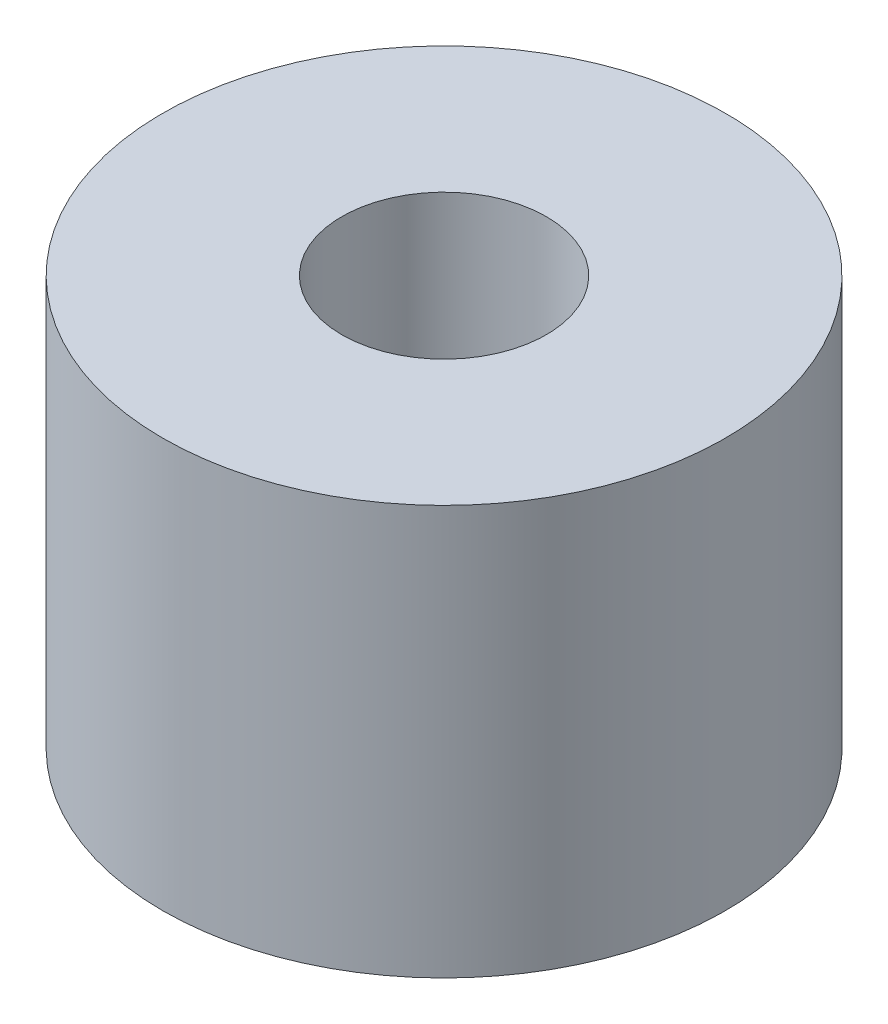
ISO-10303-21;
HEADER;
FILE_DESCRIPTION(('STEP AP214'),'2;1');
FILE_NAME('part.step','',(''),(''),'','','');
FILE_SCHEMA(('AUTOMOTIVE_DESIGN { 1 0 10303 214 1 1 1 1 }'));
ENDSEC;
DATA;
#1=APPLICATION_CONTEXT('core data for automotive mechanical design processes');
#2=APPLICATION_PROTOCOL_DEFINITION('international standard','automotive_design',2000,#1);
#3=PRODUCT_CONTEXT('',#1,'mechanical');
#4=PRODUCT('Part','Part','',(#3));
#5=PRODUCT_RELATED_PRODUCT_CATEGORY('part','',(#4));
#6=PRODUCT_DEFINITION_FORMATION('','',#4);
#7=PRODUCT_DEFINITION_CONTEXT('part definition',#1,'design');
#8=PRODUCT_DEFINITION('design','',#6,#7);
#9=PRODUCT_DEFINITION_SHAPE('','',#8);
#10=(LENGTH_UNIT() NAMED_UNIT(*) SI_UNIT(.MILLI.,.METRE.));
#11=(NAMED_UNIT(*) PLANE_ANGLE_UNIT() SI_UNIT($,.RADIAN.));
#12=(NAMED_UNIT(*) SI_UNIT($,.STERADIAN.) SOLID_ANGLE_UNIT());
#13=UNCERTAINTY_MEASURE_WITH_UNIT(LENGTH_MEASURE(1.E-05),#10,'distance_accuracy_value','');
#14=(GEOMETRIC_REPRESENTATION_CONTEXT(3) GLOBAL_UNCERTAINTY_ASSIGNED_CONTEXT((#13)) GLOBAL_UNIT_ASSIGNED_CONTEXT((#10,
#11,#12)) REPRESENTATION_CONTEXT('',''));
#15=CARTESIAN_POINT('',(0.,0.,0.));
#16=DIRECTION('',(0.,0.,1.));
#17=DIRECTION('',(1.,0.,0.));
#18=AXIS2_PLACEMENT_3D('',#15,#16,#17);
#19=CARTESIAN_POINT('',(0.,16.,0.));
#20=DIRECTION('',(0.,1.,0.));
#21=DIRECTION('',(0.,0.,1.));
#22=AXIS2_PLACEMENT_3D('',#19,#20,#21);
#23=PLANE('',#22);
#24=CARTESIAN_POINT('',(0.,16.,0.));
#25=DIRECTION('',(0.,1.,0.));
#26=DIRECTION('',(0.,0.,1.));
#27=AXIS2_PLACEMENT_3D('',#24,#25,#26);
#28=CIRCLE('',#27,11.);
#29=CARTESIAN_POINT('',(0.,16.,11.));
#30=VERTEX_POINT('',#29);
#31=EDGE_CURVE('E10',#30,#30,#28,.T.);
#32=ORIENTED_EDGE('',*,*,#31,.T.);
#33=EDGE_LOOP('',(#32));
#34=FACE_BOUND('',#33,.T.);
#35=CARTESIAN_POINT('',(0.,16.,0.));
#36=DIRECTION('',(0.,1.,0.));
#37=DIRECTION('',(0.,0.,1.));
#38=AXIS2_PLACEMENT_3D('',#35,#36,#37);
#39=CIRCLE('',#38,4.);
#40=CARTESIAN_POINT('',(0.,16.,4.));
#41=VERTEX_POINT('',#40);
#42=EDGE_CURVE('E48',#41,#41,#39,.T.);
#43=ORIENTED_EDGE('',*,*,#42,.F.);
#44=EDGE_LOOP('',(#43));
#45=FACE_BOUND('',#44,.T.);
#46=ADVANCED_FACE('F40',(#34,#45),#23,.T.);
#47=CARTESIAN_POINT('',(0.,0.,0.));
#48=DIRECTION('',(0.,1.,0.));
#49=DIRECTION('',(0.,0.,1.));
#50=AXIS2_PLACEMENT_3D('',#47,#48,#49);
#51=PLANE('',#50);
#52=CARTESIAN_POINT('',(0.,0.,0.));
#53=DIRECTION('',(0.,1.,0.));
#54=DIRECTION('',(0.,0.,1.));
#55=AXIS2_PLACEMENT_3D('',#52,#53,#54);
#56=CIRCLE('',#55,11.);
#57=CARTESIAN_POINT('',(0.,0.,11.));
#58=VERTEX_POINT('',#57);
#59=EDGE_CURVE('E41',#58,#58,#56,.T.);
#60=ORIENTED_EDGE('',*,*,#59,.F.);
#61=EDGE_LOOP('',(#60));
#62=FACE_BOUND('',#61,.T.);
#63=CARTESIAN_POINT('',(0.,0.,0.));
#64=DIRECTION('',(0.,1.,0.));
#65=DIRECTION('',(0.,0.,1.));
#66=AXIS2_PLACEMENT_3D('',#63,#64,#65);
#67=CIRCLE('',#66,4.);
#68=CARTESIAN_POINT('',(0.,0.,4.));
#69=VERTEX_POINT('',#68);
#70=EDGE_CURVE('E49',#69,#69,#67,.T.);
#71=ORIENTED_EDGE('',*,*,#70,.T.);
#72=EDGE_LOOP('',(#71));
#73=FACE_BOUND('',#72,.T.);
#74=ADVANCED_FACE('F58',(#62,#73),#51,.F.);
#75=CARTESIAN_POINT('',(0.,16.,0.));
#76=DIRECTION('',(0.,-1.,0.));
#77=DIRECTION('',(0.,0.,-1.));
#78=AXIS2_PLACEMENT_3D('',#75,#76,#77);
#79=CYLINDRICAL_SURFACE('',#78,11.);
#80=ORIENTED_EDGE('',*,*,#31,.F.);
#81=EDGE_LOOP('',(#80));
#82=FACE_BOUND('',#81,.T.);
#83=ORIENTED_EDGE('',*,*,#59,.T.);
#84=EDGE_LOOP('',(#83));
#85=FACE_BOUND('',#84,.T.);
#86=ADVANCED_FACE('F39',(#82,#85),#79,.T.);
#87=CARTESIAN_POINT('',(0.,16.,0.));
#88=DIRECTION('',(0.,-1.,0.));
#89=DIRECTION('',(0.,0.,-1.));
#90=AXIS2_PLACEMENT_3D('',#87,#88,#89);
#91=CYLINDRICAL_SURFACE('',#90,4.);
#92=ORIENTED_EDGE('',*,*,#42,.T.);
#93=EDGE_LOOP('',(#92));
#94=FACE_BOUND('',#93,.T.);
#95=ORIENTED_EDGE('',*,*,#70,.F.);
#96=EDGE_LOOP('',(#95));
#97=FACE_BOUND('',#96,.T.);
#98=ADVANCED_FACE('F57',(#94,#97),#91,.F.);
#99=CLOSED_SHELL('',(#46,#74,#86,#98));
#100=MANIFOLD_SOLID_BREP('B2',#99);
#101=ADVANCED_BREP_SHAPE_REPRESENTATION('',(#18,#100),#14);
#102=SHAPE_DEFINITION_REPRESENTATION(#9,#101);
ENDSEC;
END-ISO-10303-21;
